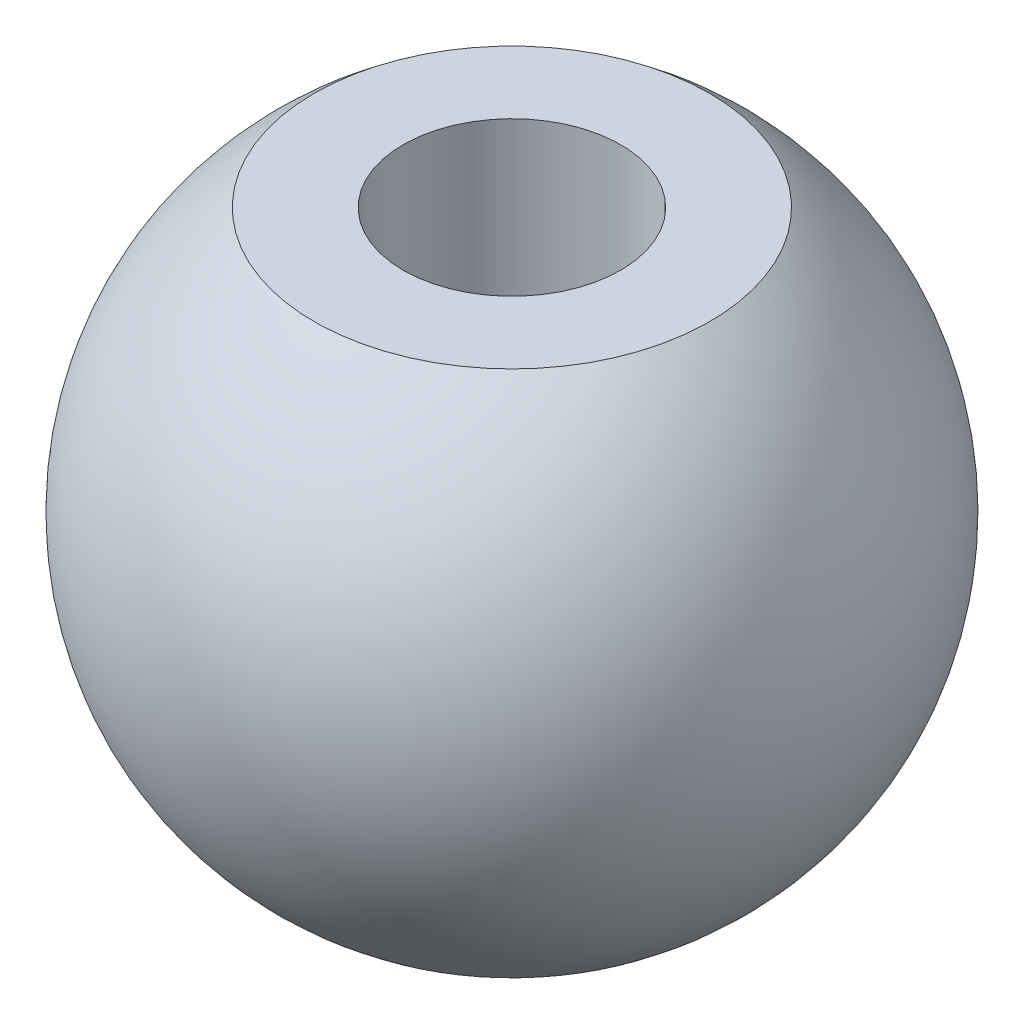
ISO-10303-21;
HEADER;
FILE_DESCRIPTION(('STEP AP214'),'2;1');
FILE_NAME('part.step','',(''),(''),'','','');
FILE_SCHEMA(('AUTOMOTIVE_DESIGN { 1 0 10303 214 1 1 1 1 }'));
ENDSEC;
DATA;
#1=APPLICATION_CONTEXT('core data for automotive mechanical design processes');
#2=APPLICATION_PROTOCOL_DEFINITION('international standard','automotive_design',2000,#1);
#3=PRODUCT_CONTEXT('',#1,'mechanical');
#4=PRODUCT('Part','Part','',(#3));
#5=PRODUCT_RELATED_PRODUCT_CATEGORY('part','',(#4));
#6=PRODUCT_DEFINITION_FORMATION('','',#4);
#7=PRODUCT_DEFINITION_CONTEXT('part definition',#1,'design');
#8=PRODUCT_DEFINITION('design','',#6,#7);
#9=PRODUCT_DEFINITION_SHAPE('','',#8);
#10=(LENGTH_UNIT() NAMED_UNIT(*) SI_UNIT(.MILLI.,.METRE.));
#11=(NAMED_UNIT(*) PLANE_ANGLE_UNIT() SI_UNIT($,.RADIAN.));
#12=(NAMED_UNIT(*) SI_UNIT($,.STERADIAN.) SOLID_ANGLE_UNIT());
#13=UNCERTAINTY_MEASURE_WITH_UNIT(LENGTH_MEASURE(1.E-05),#10,'distance_accuracy_value','');
#14=(GEOMETRIC_REPRESENTATION_CONTEXT(3) GLOBAL_UNCERTAINTY_ASSIGNED_CONTEXT((#13)) GLOBAL_UNIT_ASSIGNED_CONTEXT((#10,
#11,#12)) REPRESENTATION_CONTEXT('',''));
#15=CARTESIAN_POINT('',(0.,0.,0.));
#16=DIRECTION('',(0.,0.,1.));
#17=DIRECTION('',(1.,0.,0.));
#18=AXIS2_PLACEMENT_3D('',#15,#16,#17);
#19=CARTESIAN_POINT('',(0.,5.,0.));
#20=DIRECTION('',(0.,-1.,0.));
#21=DIRECTION('',(-1.,0.,0.));
#22=AXIS2_PLACEMENT_3D('',#19,#20,#21);
#23=SPHERICAL_SURFACE('',#22,5.);
#24=CARTESIAN_POINT('',(0.,9.,0.));
#25=DIRECTION('',(0.,-1.,0.));
#26=DIRECTION('',(0.,0.,-1.));
#27=AXIS2_PLACEMENT_3D('',#24,#25,#26);
#28=CIRCLE('',#27,3.);
#29=CARTESIAN_POINT('',(0.,9.,-3.));
#30=VERTEX_POINT('',#29);
#31=EDGE_CURVE('E11',#30,#30,#28,.T.);
#32=ORIENTED_EDGE('',*,*,#31,.T.);
#33=EDGE_LOOP('',(#32));
#34=FACE_BOUND('',#33,.T.);
#35=ADVANCED_FACE('F39',(#34),#23,.T.);
#36=CARTESIAN_POINT('',(0.,9.,0.));
#37=DIRECTION('',(0.,1.,0.));
#38=DIRECTION('',(0.,0.,1.));
#39=AXIS2_PLACEMENT_3D('',#36,#37,#38);
#40=PLANE('',#39);
#41=CARTESIAN_POINT('',(0.,9.,0.));
#42=DIRECTION('',(0.,1.,0.));
#43=DIRECTION('',(0.,0.,1.));
#44=AXIS2_PLACEMENT_3D('',#41,#42,#43);
#45=CIRCLE('',#44,1.64999999999999);
#46=CARTESIAN_POINT('',(0.,9.,1.64999999999999));
#47=VERTEX_POINT('',#46);
#48=EDGE_CURVE('E57',#47,#47,#45,.T.);
#49=ORIENTED_EDGE('',*,*,#48,.F.);
#50=EDGE_LOOP('',(#49));
#51=FACE_BOUND('',#50,.T.);
#52=ORIENTED_EDGE('',*,*,#31,.F.);
#53=EDGE_LOOP('',(#52));
#54=FACE_BOUND('',#53,.T.);
#55=ADVANCED_FACE('F52',(#51,#54),#40,.T.);
#56=CARTESIAN_POINT('',(0.,3.,0.));
#57=DIRECTION('',(0.,1.,0.));
#58=DIRECTION('',(0.,0.,1.));
#59=AXIS2_PLACEMENT_3D('',#56,#57,#58);
#60=CONICAL_SURFACE('',#59,1.65,1.02974425867665);
#61=CARTESIAN_POINT('',(0.,2.00857997860453,0.));
#62=VERTEX_POINT('',#61);
#63=VERTEX_LOOP('',#62);
#64=FACE_BOUND('',#63,.T.);
#65=CARTESIAN_POINT('',(0.,3.,0.));
#66=DIRECTION('',(0.,1.,0.));
#67=DIRECTION('',(0.,0.,1.));
#68=AXIS2_PLACEMENT_3D('',#65,#66,#67);
#69=CIRCLE('',#68,1.65);
#70=CARTESIAN_POINT('',(0.,3.,1.65));
#71=VERTEX_POINT('',#70);
#72=EDGE_CURVE('E45',#71,#71,#69,.T.);
#73=ORIENTED_EDGE('',*,*,#72,.T.);
#74=EDGE_LOOP('',(#73));
#75=FACE_BOUND('',#74,.T.);
#76=ADVANCED_FACE('F48',(#64,#75),#60,.F.);
#77=CARTESIAN_POINT('',(0.,9.,0.));
#78=DIRECTION('',(0.,1.,0.));
#79=DIRECTION('',(0.,0.,1.));
#80=AXIS2_PLACEMENT_3D('',#77,#78,#79);
#81=CYLINDRICAL_SURFACE('',#80,1.64999999999999);
#82=ORIENTED_EDGE('',*,*,#72,.F.);
#83=EDGE_LOOP('',(#82));
#84=FACE_BOUND('',#83,.T.);
#85=ORIENTED_EDGE('',*,*,#48,.T.);
#86=EDGE_LOOP('',(#85));
#87=FACE_BOUND('',#86,.T.);
#88=ADVANCED_FACE('F51',(#84,#87),#81,.F.);
#89=CLOSED_SHELL('',(#35,#55,#76,#88));
#90=MANIFOLD_SOLID_BREP('B2',#89);
#91=ADVANCED_BREP_SHAPE_REPRESENTATION('',(#18,#90),#14);
#92=SHAPE_DEFINITION_REPRESENTATION(#9,#91);
ENDSEC;
END-ISO-10303-21;
